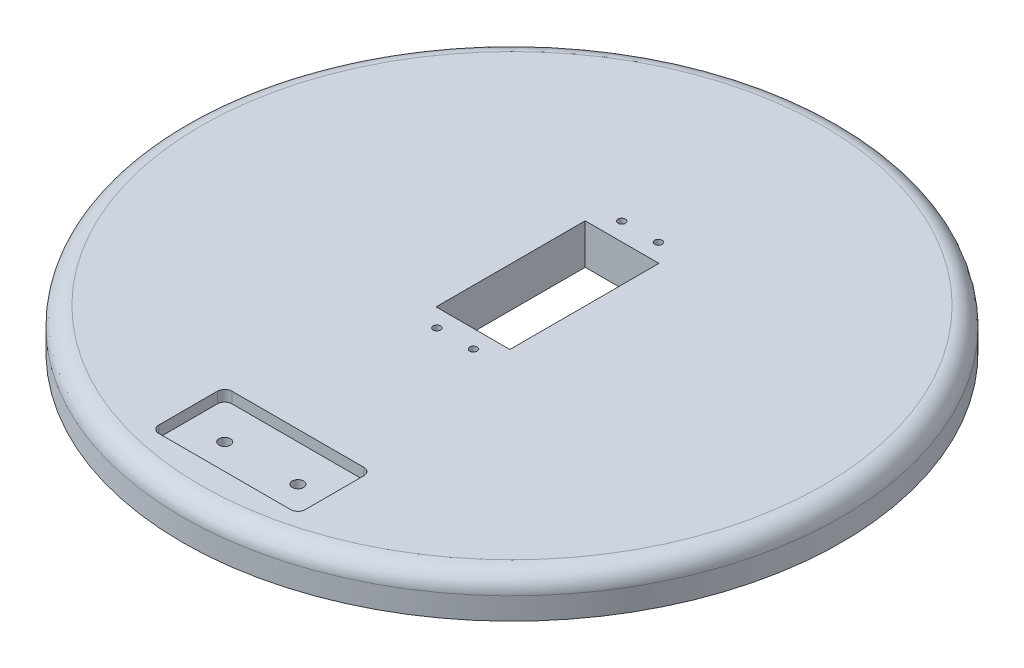
ISO-10303-21;
HEADER;
FILE_DESCRIPTION(('STEP AP214'),'2;1');
FILE_NAME('part.step','',(''),(''),'','','');
FILE_SCHEMA(('AUTOMOTIVE_DESIGN { 1 0 10303 214 1 1 1 1 }'));
ENDSEC;
DATA;
#1=APPLICATION_CONTEXT('core data for automotive mechanical design processes');
#2=APPLICATION_PROTOCOL_DEFINITION('international standard','automotive_design',2000,#1);
#3=PRODUCT_CONTEXT('',#1,'mechanical');
#4=PRODUCT('Part','Part','',(#3));
#5=PRODUCT_RELATED_PRODUCT_CATEGORY('part','',(#4));
#6=PRODUCT_DEFINITION_FORMATION('','',#4);
#7=PRODUCT_DEFINITION_CONTEXT('part definition',#1,'design');
#8=PRODUCT_DEFINITION('design','',#6,#7);
#9=PRODUCT_DEFINITION_SHAPE('','',#8);
#10=(LENGTH_UNIT() NAMED_UNIT(*) SI_UNIT(.MILLI.,.METRE.));
#11=(NAMED_UNIT(*) PLANE_ANGLE_UNIT() SI_UNIT($,.RADIAN.));
#12=(NAMED_UNIT(*) SI_UNIT($,.STERADIAN.) SOLID_ANGLE_UNIT());
#13=UNCERTAINTY_MEASURE_WITH_UNIT(LENGTH_MEASURE(1.E-05),#10,'distance_accuracy_value','');
#14=(GEOMETRIC_REPRESENTATION_CONTEXT(3) GLOBAL_UNCERTAINTY_ASSIGNED_CONTEXT((#13)) GLOBAL_UNIT_ASSIGNED_CONTEXT((#10,
#11,#12)) REPRESENTATION_CONTEXT('',''));
#15=CARTESIAN_POINT('',(0.,0.,0.));
#16=DIRECTION('',(0.,0.,1.));
#17=DIRECTION('',(1.,0.,0.));
#18=AXIS2_PLACEMENT_3D('',#15,#16,#17);
#19=CARTESIAN_POINT('',(0.,0.,0.));
#20=DIRECTION('',(0.,1.,0.));
#21=DIRECTION('',(0.,0.,1.));
#22=AXIS2_PLACEMENT_3D('',#19,#20,#21);
#23=PLANE('',#22);
#24=DIRECTION('',(1.,0.,0.));
#25=VECTOR('',#24,1.);
#26=CARTESIAN_POINT('',(0.,0.,10.6551884753543));
#27=LINE('',#26,#25);
#28=CARTESIAN_POINT('',(-10.0693248569401,0.,10.6551884753543));
#29=VERTEX_POINT('',#28);
#30=CARTESIAN_POINT('',(10.0705214341303,0.,10.6551884753543));
#31=VERTEX_POINT('',#30);
#32=EDGE_CURVE('E175',#29,#31,#27,.T.);
#33=ORIENTED_EDGE('',*,*,#32,.T.);
#34=DIRECTION('',(0.,0.,-1.));
#35=VECTOR('',#34,1.);
#36=CARTESIAN_POINT('',(10.0705214341303,0.,0.));
#37=LINE('',#36,#35);
#38=CARTESIAN_POINT('',(10.0705214341303,0.,-30.0651436325552));
#39=VERTEX_POINT('',#38);
#40=EDGE_CURVE('E179',#31,#39,#37,.T.);
#41=ORIENTED_EDGE('',*,*,#40,.T.);
#42=DIRECTION('',(-1.,0.,0.));
#43=VECTOR('',#42,1.);
#44=CARTESIAN_POINT('',(0.,0.,-30.0651436325552));
#45=LINE('',#44,#43);
#46=CARTESIAN_POINT('',(-10.0693248569401,0.,-30.0651436325552));
#47=VERTEX_POINT('',#46);
#48=EDGE_CURVE('E166',#39,#47,#45,.T.);
#49=ORIENTED_EDGE('',*,*,#48,.T.);
#50=DIRECTION('',(0.,0.,1.));
#51=VECTOR('',#50,1.);
#52=CARTESIAN_POINT('',(-10.0693248569401,0.,0.));
#53=LINE('',#52,#51);
#54=EDGE_CURVE('E141',#47,#29,#53,.T.);
#55=ORIENTED_EDGE('',*,*,#54,.T.);
#56=EDGE_LOOP('',(#33,#41,#49,#55));
#57=FACE_BOUND('',#56,.T.);
#58=CARTESIAN_POINT('',(-9.99999999999957,0.,68.4612874102777));
#59=DIRECTION('',(0.,-1.,0.));
#60=DIRECTION('',(0.,0.,-1.));
#61=AXIS2_PLACEMENT_3D('',#58,#59,#60);
#62=CIRCLE('',#61,3.);
#63=CARTESIAN_POINT('',(-9.99999999999957,0.,65.4612874102777));
#64=VERTEX_POINT('',#63);
#65=EDGE_CURVE('E209',#64,#64,#62,.T.);
#66=ORIENTED_EDGE('',*,*,#65,.F.);
#67=EDGE_LOOP('',(#66));
#68=FACE_BOUND('',#67,.T.);
#69=CARTESIAN_POINT('',(10.0000000000004,0.,68.4612874102777));
#70=DIRECTION('',(0.,-1.,0.));
#71=DIRECTION('',(0.,0.,-1.));
#72=AXIS2_PLACEMENT_3D('',#69,#70,#71);
#73=CIRCLE('',#72,3.);
#74=CARTESIAN_POINT('',(10.0000000000004,0.,65.4612874102777));
#75=VERTEX_POINT('',#74);
#76=EDGE_CURVE('E205',#75,#75,#73,.T.);
#77=ORIENTED_EDGE('',*,*,#76,.F.);
#78=EDGE_LOOP('',(#77));
#79=FACE_BOUND('',#78,.T.);
#80=CARTESIAN_POINT('',(7.22641595890606E-12,0.,1.67605903282807E-12));
#81=DIRECTION('',(0.,-1.,0.));
#82=DIRECTION('',(0.,0.,-1.));
#83=AXIS2_PLACEMENT_3D('',#80,#81,#82);
#84=CIRCLE('',#83,75.1999999999923);
#85=CARTESIAN_POINT('',(7.22641595890606E-12,0.,-75.1999999999906));
#86=VERTEX_POINT('',#85);
#87=EDGE_CURVE('E183',#86,#86,#84,.T.);
#88=ORIENTED_EDGE('',*,*,#87,.T.);
#89=EDGE_LOOP('',(#88));
#90=FACE_BOUND('',#89,.T.);
#91=ADVANCED_FACE('F45',(#57,#68,#79,#90),#23,.F.);
#92=CARTESIAN_POINT('',(-9.99999999999957,-12.,68.4612874102777));
#93=DIRECTION('',(0.,1.,0.));
#94=DIRECTION('',(0.,0.,1.));
#95=AXIS2_PLACEMENT_3D('',#92,#93,#94);
#96=CYLINDRICAL_SURFACE('',#95,1.55);
#97=CARTESIAN_POINT('',(-9.99999999999957,8.,68.4612874102777));
#98=DIRECTION('',(0.,1.,0.));
#99=DIRECTION('',(0.,0.,1.));
#100=AXIS2_PLACEMENT_3D('',#97,#98,#99);
#101=CIRCLE('',#100,1.55);
#102=CARTESIAN_POINT('',(-9.99999999999957,8.,70.0112874102777));
#103=VERTEX_POINT('',#102);
#104=EDGE_CURVE('E221',#103,#103,#101,.T.);
#105=ORIENTED_EDGE('',*,*,#104,.T.);
#106=EDGE_LOOP('',(#105));
#107=FACE_BOUND('',#106,.T.);
#108=CARTESIAN_POINT('',(-9.99999999999957,3.,68.4612874102777));
#109=DIRECTION('',(0.,-1.,0.));
#110=DIRECTION('',(0.,0.,-1.));
#111=AXIS2_PLACEMENT_3D('',#108,#109,#110);
#112=CIRCLE('',#111,1.55);
#113=CARTESIAN_POINT('',(-9.99999999999957,3.,66.9112874102777));
#114=VERTEX_POINT('',#113);
#115=EDGE_CURVE('E225',#114,#114,#112,.F.);
#116=ORIENTED_EDGE('',*,*,#115,.F.);
#117=EDGE_LOOP('',(#116));
#118=FACE_BOUND('',#117,.T.);
#119=ADVANCED_FACE('F339',(#107,#118),#96,.F.);
#120=CARTESIAN_POINT('',(10.0000000000004,-12.,68.4612874102777));
#121=DIRECTION('',(0.,1.,0.));
#122=DIRECTION('',(0.,0.,1.));
#123=AXIS2_PLACEMENT_3D('',#120,#121,#122);
#124=CYLINDRICAL_SURFACE('',#123,1.55);
#125=CARTESIAN_POINT('',(10.0000000000004,8.,68.4612874102777));
#126=DIRECTION('',(0.,1.,0.));
#127=DIRECTION('',(0.,0.,1.));
#128=AXIS2_PLACEMENT_3D('',#125,#126,#127);
#129=CIRCLE('',#128,1.55);
#130=CARTESIAN_POINT('',(10.0000000000004,8.,70.0112874102777));
#131=VERTEX_POINT('',#130);
#132=EDGE_CURVE('E216',#131,#131,#129,.T.);
#133=ORIENTED_EDGE('',*,*,#132,.T.);
#134=EDGE_LOOP('',(#133));
#135=FACE_BOUND('',#134,.T.);
#136=CARTESIAN_POINT('',(10.0000000000004,3.,68.4612874102777));
#137=DIRECTION('',(0.,-1.,0.));
#138=DIRECTION('',(0.,0.,-1.));
#139=AXIS2_PLACEMENT_3D('',#136,#137,#138);
#140=CIRCLE('',#139,1.55);
#141=CARTESIAN_POINT('',(10.0000000000004,3.,66.9112874102777));
#142=VERTEX_POINT('',#141);
#143=EDGE_CURVE('E204',#142,#142,#140,.F.);
#144=ORIENTED_EDGE('',*,*,#143,.F.);
#145=EDGE_LOOP('',(#144));
#146=FACE_BOUND('',#145,.T.);
#147=ADVANCED_FACE('F346',(#135,#146),#124,.F.);
#148=CARTESIAN_POINT('',(0.,11.,0.));
#149=DIRECTION('',(0.,-1.,0.));
#150=DIRECTION('',(0.,0.,-1.));
#151=AXIS2_PLACEMENT_3D('',#148,#149,#150);
#152=CYLINDRICAL_SURFACE('',#151,90.);
#153=CARTESIAN_POINT('',(0.,6.,0.));
#154=DIRECTION('',(0.,1.,0.));
#155=DIRECTION('',(0.,0.,1.));
#156=AXIS2_PLACEMENT_3D('',#153,#154,#155);
#157=CIRCLE('',#156,90.);
#158=CARTESIAN_POINT('',(0.,6.,90.));
#159=VERTEX_POINT('',#158);
#160=EDGE_CURVE('E11',#159,#159,#157,.F.);
#161=ORIENTED_EDGE('',*,*,#160,.T.);
#162=EDGE_LOOP('',(#161));
#163=FACE_BOUND('',#162,.T.);
#164=CARTESIAN_POINT('',(0.,0.,0.));
#165=DIRECTION('',(0.,1.,0.));
#166=DIRECTION('',(0.,0.,1.));
#167=AXIS2_PLACEMENT_3D('',#164,#165,#166);
#168=CIRCLE('',#167,90.);
#169=CARTESIAN_POINT('',(0.,0.,90.));
#170=VERTEX_POINT('',#169);
#171=EDGE_CURVE('E241',#170,#170,#168,.T.);
#172=ORIENTED_EDGE('',*,*,#171,.T.);
#173=EDGE_LOOP('',(#172));
#174=FACE_BOUND('',#173,.T.);
#175=ADVANCED_FACE('F364',(#163,#174),#152,.T.);
#176=CARTESIAN_POINT('',(0.,11.,0.));
#177=DIRECTION('',(0.,1.,0.));
#178=DIRECTION('',(0.,0.,1.));
#179=AXIS2_PLACEMENT_3D('',#176,#177,#178);
#180=PLANE('',#179);
#181=CARTESIAN_POINT('',(5.,11.,-34.9655002999993));
#182=DIRECTION('',(0.,1.,0.));
#183=DIRECTION('',(0.,0.,1.));
#184=AXIS2_PLACEMENT_3D('',#181,#182,#183);
#185=CIRCLE('',#184,1.);
#186=CARTESIAN_POINT('',(5.,11.,-33.9655002999993));
#187=VERTEX_POINT('',#186);
#188=EDGE_CURVE('E511',#187,#187,#185,.T.);
#189=ORIENTED_EDGE('',*,*,#188,.F.);
#190=EDGE_LOOP('',(#189));
#191=FACE_BOUND('',#190,.T.);
#192=CARTESIAN_POINT('',(-5.,11.,15.5345003000007));
#193=DIRECTION('',(0.,1.,0.));
#194=DIRECTION('',(0.,0.,1.));
#195=AXIS2_PLACEMENT_3D('',#192,#193,#194);
#196=CIRCLE('',#195,1.);
#197=CARTESIAN_POINT('',(-5.,11.,16.5345003000007));
#198=VERTEX_POINT('',#197);
#199=EDGE_CURVE('E507',#198,#198,#196,.T.);
#200=ORIENTED_EDGE('',*,*,#199,.F.);
#201=EDGE_LOOP('',(#200));
#202=FACE_BOUND('',#201,.T.);
#203=CARTESIAN_POINT('',(5.,11.,15.5345003000007));
#204=DIRECTION('',(0.,1.,0.));
#205=DIRECTION('',(0.,0.,1.));
#206=AXIS2_PLACEMENT_3D('',#203,#204,#205);
#207=CIRCLE('',#206,1.);
#208=CARTESIAN_POINT('',(5.,11.,16.5345003000007));
#209=VERTEX_POINT('',#208);
#210=EDGE_CURVE('E499',#209,#209,#207,.T.);
#211=ORIENTED_EDGE('',*,*,#210,.F.);
#212=EDGE_LOOP('',(#211));
#213=FACE_BOUND('',#212,.T.);
#214=CARTESIAN_POINT('',(-5.,11.,-34.9655002999993));
#215=DIRECTION('',(0.,1.,0.));
#216=DIRECTION('',(0.,0.,1.));
#217=AXIS2_PLACEMENT_3D('',#214,#215,#216);
#218=CIRCLE('',#217,1.);
#219=CARTESIAN_POINT('',(-5.,11.,-33.9655002999993));
#220=VERTEX_POINT('',#219);
#221=EDGE_CURVE('E515',#220,#220,#218,.T.);
#222=ORIENTED_EDGE('',*,*,#221,.F.);
#223=EDGE_LOOP('',(#222));
#224=FACE_BOUND('',#223,.T.);
#225=DIRECTION('',(0.,0.,-1.));
#226=VECTOR('',#225,1.);
#227=CARTESIAN_POINT('',(10.0705214341303,11.,10.6551884753543));
#228=LINE('',#227,#226);
#229=CARTESIAN_POINT('',(10.0705214341303,11.,10.6551884753543));
#230=VERTEX_POINT('',#229);
#231=CARTESIAN_POINT('',(10.0705214341303,11.,-30.0651436325552));
#232=VERTEX_POINT('',#231);
#233=EDGE_CURVE('E69',#230,#232,#228,.T.);
#234=ORIENTED_EDGE('',*,*,#233,.F.);
#235=DIRECTION('',(1.,0.,0.));
#236=VECTOR('',#235,1.);
#237=CARTESIAN_POINT('',(10.0705214341303,11.,10.6551884753543));
#238=LINE('',#237,#236);
#239=CARTESIAN_POINT('',(-10.0693248569401,11.,10.6551884753543));
#240=VERTEX_POINT('',#239);
#241=EDGE_CURVE('E156',#240,#230,#238,.T.);
#242=ORIENTED_EDGE('',*,*,#241,.F.);
#243=DIRECTION('',(0.,0.,1.));
#244=VECTOR('',#243,1.);
#245=CARTESIAN_POINT('',(-10.0693248569401,11.,10.6551884753543));
#246=LINE('',#245,#244);
#247=CARTESIAN_POINT('',(-10.0693248569401,11.,-30.0651436325552));
#248=VERTEX_POINT('',#247);
#249=EDGE_CURVE('E138',#248,#240,#246,.T.);
#250=ORIENTED_EDGE('',*,*,#249,.F.);
#251=DIRECTION('',(-1.,0.,0.));
#252=VECTOR('',#251,1.);
#253=CARTESIAN_POINT('',(10.0705214341303,11.,-30.0651436325552));
#254=LINE('',#253,#252);
#255=EDGE_CURVE('E148',#232,#248,#254,.T.);
#256=ORIENTED_EDGE('',*,*,#255,.F.);
#257=EDGE_LOOP('',(#234,#242,#250,#256));
#258=FACE_BOUND('',#257,.T.);
#259=CARTESIAN_POINT('',(0.,11.,0.));
#260=DIRECTION('',(0.,1.,0.));
#261=DIRECTION('',(0.,0.,1.));
#262=AXIS2_PLACEMENT_3D('',#259,#260,#261);
#263=CIRCLE('',#262,85.);
#264=CARTESIAN_POINT('',(0.,11.,85.));
#265=VERTEX_POINT('',#264);
#266=EDGE_CURVE('E54',#265,#265,#263,.T.);
#267=ORIENTED_EDGE('',*,*,#266,.T.);
#268=EDGE_LOOP('',(#267));
#269=FACE_BOUND('',#268,.T.);
#270=DIRECTION('',(0.,0.,1.));
#271=VECTOR('',#270,1.);
#272=CARTESIAN_POINT('',(-19.9999999999999,11.,58.4612874102777));
#273=LINE('',#272,#271);
#274=CARTESIAN_POINT('',(-19.9999999999999,11.,60.4612874102777));
#275=VERTEX_POINT('',#274);
#276=CARTESIAN_POINT('',(-19.9999999999999,11.,76.4612874102777));
#277=VERTEX_POINT('',#276);
#278=EDGE_CURVE('E220',#275,#277,#273,.T.);
#279=ORIENTED_EDGE('',*,*,#278,.F.);
#280=CARTESIAN_POINT('',(-17.9999999999999,11.,60.4612874102777));
#281=DIRECTION('',(0.,1.,0.));
#282=DIRECTION('',(0.,0.,1.));
#283=AXIS2_PLACEMENT_3D('',#280,#281,#282);
#284=CIRCLE('',#283,2.);
#285=CARTESIAN_POINT('',(-17.9999999999999,11.,58.4612874102777));
#286=VERTEX_POINT('',#285);
#287=EDGE_CURVE('E274',#275,#286,#284,.F.);
#288=ORIENTED_EDGE('',*,*,#287,.T.);
#289=DIRECTION('',(-1.,0.,0.));
#290=VECTOR('',#289,1.);
#291=CARTESIAN_POINT('',(-19.9999999999999,11.,58.4612874102777));
#292=LINE('',#291,#290);
#293=CARTESIAN_POINT('',(18.0000000000001,11.,58.4612874102777));
#294=VERTEX_POINT('',#293);
#295=EDGE_CURVE('E231',#294,#286,#292,.T.);
#296=ORIENTED_EDGE('',*,*,#295,.F.);
#297=CARTESIAN_POINT('',(18.0000000000001,11.,60.4612874102777));
#298=DIRECTION('',(0.,1.,0.));
#299=DIRECTION('',(0.,0.,1.));
#300=AXIS2_PLACEMENT_3D('',#297,#298,#299);
#301=CIRCLE('',#300,2.);
#302=CARTESIAN_POINT('',(20.0000000000001,11.,60.4612874102777));
#303=VERTEX_POINT('',#302);
#304=EDGE_CURVE('E289',#294,#303,#301,.F.);
#305=ORIENTED_EDGE('',*,*,#304,.T.);
#306=DIRECTION('',(0.,0.,-1.));
#307=VECTOR('',#306,1.);
#308=CARTESIAN_POINT('',(20.0000000000001,11.,58.4612874102777));
#309=LINE('',#308,#307);
#310=CARTESIAN_POINT('',(20.0000000000001,11.,76.4612874102777));
#311=VERTEX_POINT('',#310);
#312=EDGE_CURVE('E249',#311,#303,#309,.T.);
#313=ORIENTED_EDGE('',*,*,#312,.F.);
#314=CARTESIAN_POINT('',(18.0000000000001,11.,76.4612874102777));
#315=DIRECTION('',(0.,1.,0.));
#316=DIRECTION('',(0.,0.,1.));
#317=AXIS2_PLACEMENT_3D('',#314,#315,#316);
#318=CIRCLE('',#317,2.);
#319=CARTESIAN_POINT('',(18.0000000000001,11.,78.4612874102777));
#320=VERTEX_POINT('',#319);
#321=EDGE_CURVE('E316',#311,#320,#318,.F.);
#322=ORIENTED_EDGE('',*,*,#321,.T.);
#323=DIRECTION('',(1.,0.,0.));
#324=VECTOR('',#323,1.);
#325=CARTESIAN_POINT('',(-19.9999999999999,11.,78.4612874102777));
#326=LINE('',#325,#324);
#327=CARTESIAN_POINT('',(-17.9999999999999,11.,78.4612874102777));
#328=VERTEX_POINT('',#327);
#329=EDGE_CURVE('E245',#328,#320,#326,.T.);
#330=ORIENTED_EDGE('',*,*,#329,.F.);
#331=CARTESIAN_POINT('',(-17.9999999999999,11.,76.4612874102777));
#332=DIRECTION('',(0.,1.,0.));
#333=DIRECTION('',(0.,0.,1.));
#334=AXIS2_PLACEMENT_3D('',#331,#332,#333);
#335=CIRCLE('',#334,2.);
#336=EDGE_CURVE('E303',#328,#277,#335,.F.);
#337=ORIENTED_EDGE('',*,*,#336,.T.);
#338=EDGE_LOOP('',(#279,#288,#296,#305,#313,#322,#330,#337));
#339=FACE_BOUND('',#338,.T.);
#340=ADVANCED_FACE('F153',(#191,#202,#213,#224,#258,#269,#339),#180,.T.);
#341=CARTESIAN_POINT('',(7.22641595890606E-12,0.,1.67605903282807E-12));
#342=DIRECTION('',(0.,-1.,0.));
#343=DIRECTION('',(0.,0.,-1.));
#344=AXIS2_PLACEMENT_3D('',#341,#342,#343);
#345=CIRCLE('',#344,85.1999999999923);
#346=CARTESIAN_POINT('',(7.22641595890606E-12,0.,-85.1999999999906));
#347=VERTEX_POINT('',#346);
#348=EDGE_CURVE('E188',#347,#347,#345,.T.);
#349=ORIENTED_EDGE('',*,*,#348,.F.);
#350=EDGE_LOOP('',(#349));
#351=FACE_BOUND('',#350,.T.);
#352=ORIENTED_EDGE('',*,*,#171,.F.);
#353=EDGE_LOOP('',(#352));
#354=FACE_BOUND('',#353,.T.);
#355=ADVANCED_FACE('F342',(#351,#354),#23,.F.);
#356=CARTESIAN_POINT('',(-19.9999999999999,8.,58.4612874102777));
#357=DIRECTION('',(-1.,0.,0.));
#358=DIRECTION('',(0.,0.,1.));
#359=AXIS2_PLACEMENT_3D('',#356,#357,#358);
#360=PLANE('',#359);
#361=ORIENTED_EDGE('',*,*,#278,.T.);
#362=DIRECTION('',(0.,1.,0.));
#363=VECTOR('',#362,1.);
#364=CARTESIAN_POINT('',(-19.9999999999999,8.,76.4612874102777));
#365=LINE('',#364,#363);
#366=CARTESIAN_POINT('',(-19.9999999999999,8.,76.4612874102777));
#367=VERTEX_POINT('',#366);
#368=EDGE_CURVE('E297',#277,#367,#365,.F.);
#369=ORIENTED_EDGE('',*,*,#368,.T.);
#370=DIRECTION('',(0.,0.,1.));
#371=VECTOR('',#370,1.);
#372=CARTESIAN_POINT('',(-19.9999999999999,8.,58.4612874102777));
#373=LINE('',#372,#371);
#374=CARTESIAN_POINT('',(-19.9999999999999,8.,60.4612874102777));
#375=VERTEX_POINT('',#374);
#376=EDGE_CURVE('E226',#375,#367,#373,.T.);
#377=ORIENTED_EDGE('',*,*,#376,.F.);
#378=DIRECTION('',(0.,1.,0.));
#379=VECTOR('',#378,1.);
#380=CARTESIAN_POINT('',(-19.9999999999999,11.,60.4612874102777));
#381=LINE('',#380,#379);
#382=EDGE_CURVE('E257',#375,#275,#381,.T.);
#383=ORIENTED_EDGE('',*,*,#382,.T.);
#384=EDGE_LOOP('',(#361,#369,#377,#383));
#385=FACE_BOUND('',#384,.T.);
#386=ADVANCED_FACE('F353',(#385),#360,.F.);
#387=CARTESIAN_POINT('',(-19.9999999999999,8.,58.4612874102777));
#388=DIRECTION('',(0.,0.,-1.));
#389=DIRECTION('',(-1.,0.,0.));
#390=AXIS2_PLACEMENT_3D('',#387,#388,#389);
#391=PLANE('',#390);
#392=DIRECTION('',(-1.,0.,0.));
#393=VECTOR('',#392,1.);
#394=CARTESIAN_POINT('',(-19.9999999999999,8.,58.4612874102777));
#395=LINE('',#394,#393);
#396=CARTESIAN_POINT('',(18.0000000000001,8.,58.4612874102777));
#397=VERTEX_POINT('',#396);
#398=CARTESIAN_POINT('',(-17.9999999999999,8.,58.4612874102777));
#399=VERTEX_POINT('',#398);
#400=EDGE_CURVE('E238',#397,#399,#395,.T.);
#401=ORIENTED_EDGE('',*,*,#400,.F.);
#402=DIRECTION('',(0.,1.,0.));
#403=VECTOR('',#402,1.);
#404=CARTESIAN_POINT('',(18.0000000000001,11.,58.4612874102777));
#405=LINE('',#404,#403);
#406=EDGE_CURVE('E278',#397,#294,#405,.T.);
#407=ORIENTED_EDGE('',*,*,#406,.T.);
#408=ORIENTED_EDGE('',*,*,#295,.T.);
#409=DIRECTION('',(0.,1.,0.));
#410=VECTOR('',#409,1.);
#411=CARTESIAN_POINT('',(-17.9999999999999,8.,58.4612874102777));
#412=LINE('',#411,#410);
#413=EDGE_CURVE('E267',#286,#399,#412,.F.);
#414=ORIENTED_EDGE('',*,*,#413,.T.);
#415=EDGE_LOOP('',(#401,#407,#408,#414));
#416=FACE_BOUND('',#415,.T.);
#417=ADVANCED_FACE('F360',(#416),#391,.F.);
#418=CARTESIAN_POINT('',(20.0000000000001,8.,58.4612874102777));
#419=DIRECTION('',(1.,0.,0.));
#420=DIRECTION('',(0.,0.,-1.));
#421=AXIS2_PLACEMENT_3D('',#418,#419,#420);
#422=PLANE('',#421);
#423=DIRECTION('',(0.,0.,-1.));
#424=VECTOR('',#423,1.);
#425=CARTESIAN_POINT('',(20.0000000000001,8.,58.4612874102777));
#426=LINE('',#425,#424);
#427=CARTESIAN_POINT('',(20.0000000000001,8.,76.4612874102777));
#428=VERTEX_POINT('',#427);
#429=CARTESIAN_POINT('',(20.0000000000001,8.,60.4612874102777));
#430=VERTEX_POINT('',#429);
#431=EDGE_CURVE('E235',#428,#430,#426,.T.);
#432=ORIENTED_EDGE('',*,*,#431,.F.);
#433=DIRECTION('',(0.,1.,0.));
#434=VECTOR('',#433,1.);
#435=CARTESIAN_POINT('',(20.0000000000001,11.,76.4612874102777));
#436=LINE('',#435,#434);
#437=EDGE_CURVE('E306',#428,#311,#436,.T.);
#438=ORIENTED_EDGE('',*,*,#437,.T.);
#439=ORIENTED_EDGE('',*,*,#312,.T.);
#440=DIRECTION('',(0.,1.,0.));
#441=VECTOR('',#440,1.);
#442=CARTESIAN_POINT('',(20.0000000000001,8.,60.4612874102777));
#443=LINE('',#442,#441);
#444=EDGE_CURVE('E282',#303,#430,#443,.F.);
#445=ORIENTED_EDGE('',*,*,#444,.T.);
#446=EDGE_LOOP('',(#432,#438,#439,#445));
#447=FACE_BOUND('',#446,.T.);
#448=ADVANCED_FACE('F405',(#447),#422,.F.);
#449=CARTESIAN_POINT('',(-19.9999999999999,8.,78.4612874102777));
#450=DIRECTION('',(0.,0.,1.));
#451=DIRECTION('',(1.,0.,0.));
#452=AXIS2_PLACEMENT_3D('',#449,#450,#451);
#453=PLANE('',#452);
#454=ORIENTED_EDGE('',*,*,#329,.T.);
#455=DIRECTION('',(0.,1.,0.));
#456=VECTOR('',#455,1.);
#457=CARTESIAN_POINT('',(18.0000000000001,8.,78.4612874102777));
#458=LINE('',#457,#456);
#459=CARTESIAN_POINT('',(18.0000000000001,8.,78.4612874102777));
#460=VERTEX_POINT('',#459);
#461=EDGE_CURVE('E310',#320,#460,#458,.F.);
#462=ORIENTED_EDGE('',*,*,#461,.T.);
#463=DIRECTION('',(1.,0.,0.));
#464=VECTOR('',#463,1.);
#465=CARTESIAN_POINT('',(-19.9999999999999,8.,78.4612874102777));
#466=LINE('',#465,#464);
#467=CARTESIAN_POINT('',(-17.9999999999999,8.,78.4612874102777));
#468=VERTEX_POINT('',#467);
#469=EDGE_CURVE('E230',#468,#460,#466,.T.);
#470=ORIENTED_EDGE('',*,*,#469,.F.);
#471=DIRECTION('',(0.,1.,0.));
#472=VECTOR('',#471,1.);
#473=CARTESIAN_POINT('',(-17.9999999999999,11.,78.4612874102777));
#474=LINE('',#473,#472);
#475=EDGE_CURVE('E293',#468,#328,#474,.T.);
#476=ORIENTED_EDGE('',*,*,#475,.T.);
#477=EDGE_LOOP('',(#454,#462,#470,#476));
#478=FACE_BOUND('',#477,.T.);
#479=ADVANCED_FACE('F422',(#478),#453,.F.);
#480=CARTESIAN_POINT('',(0.,8.,0.));
#481=DIRECTION('',(0.,1.,0.));
#482=DIRECTION('',(0.,0.,1.));
#483=AXIS2_PLACEMENT_3D('',#480,#481,#482);
#484=PLANE('',#483);
#485=ORIENTED_EDGE('',*,*,#132,.F.);
#486=EDGE_LOOP('',(#485));
#487=FACE_BOUND('',#486,.T.);
#488=ORIENTED_EDGE('',*,*,#104,.F.);
#489=EDGE_LOOP('',(#488));
#490=FACE_BOUND('',#489,.T.);
#491=ORIENTED_EDGE('',*,*,#469,.T.);
#492=CARTESIAN_POINT('',(18.0000000000001,8.,76.4612874102777));
#493=DIRECTION('',(0.,1.,0.));
#494=DIRECTION('',(0.,0.,1.));
#495=AXIS2_PLACEMENT_3D('',#492,#493,#494);
#496=CIRCLE('',#495,2.);
#497=EDGE_CURVE('E313',#460,#428,#496,.T.);
#498=ORIENTED_EDGE('',*,*,#497,.T.);
#499=ORIENTED_EDGE('',*,*,#431,.T.);
#500=CARTESIAN_POINT('',(18.0000000000001,8.,60.4612874102777));
#501=DIRECTION('',(0.,1.,0.));
#502=DIRECTION('',(0.,0.,1.));
#503=AXIS2_PLACEMENT_3D('',#500,#501,#502);
#504=CIRCLE('',#503,2.);
#505=EDGE_CURVE('E286',#430,#397,#504,.T.);
#506=ORIENTED_EDGE('',*,*,#505,.T.);
#507=ORIENTED_EDGE('',*,*,#400,.T.);
#508=CARTESIAN_POINT('',(-17.9999999999999,8.,60.4612874102777));
#509=DIRECTION('',(0.,1.,0.));
#510=DIRECTION('',(0.,0.,1.));
#511=AXIS2_PLACEMENT_3D('',#508,#509,#510);
#512=CIRCLE('',#511,2.);
#513=EDGE_CURVE('E271',#399,#375,#512,.T.);
#514=ORIENTED_EDGE('',*,*,#513,.T.);
#515=ORIENTED_EDGE('',*,*,#376,.T.);
#516=CARTESIAN_POINT('',(-17.9999999999999,8.,76.4612874102777));
#517=DIRECTION('',(0.,1.,0.));
#518=DIRECTION('',(0.,0.,1.));
#519=AXIS2_PLACEMENT_3D('',#516,#517,#518);
#520=CIRCLE('',#519,2.);
#521=EDGE_CURVE('E300',#367,#468,#520,.T.);
#522=ORIENTED_EDGE('',*,*,#521,.T.);
#523=EDGE_LOOP('',(#491,#498,#499,#506,#507,#514,#515,#522));
#524=FACE_BOUND('',#523,.T.);
#525=ADVANCED_FACE('F402',(#487,#490,#524),#484,.T.);
#526=CARTESIAN_POINT('',(10.0000000000004,3.,68.4612874102777));
#527=DIRECTION('',(0.,-1.,0.));
#528=DIRECTION('',(0.,0.,-1.));
#529=AXIS2_PLACEMENT_3D('',#526,#527,#528);
#530=PLANE('',#529);
#531=CARTESIAN_POINT('',(10.0000000000004,3.,68.4612874102777));
#532=DIRECTION('',(0.,-1.,0.));
#533=DIRECTION('',(0.,0.,-1.));
#534=AXIS2_PLACEMENT_3D('',#531,#532,#533);
#535=CIRCLE('',#534,3.);
#536=CARTESIAN_POINT('',(10.0000000000004,3.,65.4612874102777));
#537=VERTEX_POINT('',#536);
#538=EDGE_CURVE('E200',#537,#537,#535,.T.);
#539=ORIENTED_EDGE('',*,*,#538,.T.);
#540=EDGE_LOOP('',(#539));
#541=FACE_BOUND('',#540,.T.);
#542=ORIENTED_EDGE('',*,*,#143,.T.);
#543=EDGE_LOOP('',(#542));
#544=FACE_BOUND('',#543,.T.);
#545=ADVANCED_FACE('F429',(#541,#544),#530,.T.);
#546=CARTESIAN_POINT('',(10.0000000000004,3.,68.4612874102777));
#547=DIRECTION('',(0.,-1.,0.));
#548=DIRECTION('',(0.,0.,-1.));
#549=AXIS2_PLACEMENT_3D('',#546,#547,#548);
#550=CYLINDRICAL_SURFACE('',#549,3.);
#551=ORIENTED_EDGE('',*,*,#538,.F.);
#552=EDGE_LOOP('',(#551));
#553=FACE_BOUND('',#552,.T.);
#554=ORIENTED_EDGE('',*,*,#76,.T.);
#555=EDGE_LOOP('',(#554));
#556=FACE_BOUND('',#555,.T.);
#557=ADVANCED_FACE('F439',(#553,#556),#550,.F.);
#558=CARTESIAN_POINT('',(-9.99999999999957,3.,68.4612874102777));
#559=DIRECTION('',(0.,-1.,0.));
#560=DIRECTION('',(0.,0.,-1.));
#561=AXIS2_PLACEMENT_3D('',#558,#559,#560);
#562=PLANE('',#561);
#563=CARTESIAN_POINT('',(-9.99999999999957,3.,68.4612874102777));
#564=DIRECTION('',(0.,-1.,0.));
#565=DIRECTION('',(0.,0.,-1.));
#566=AXIS2_PLACEMENT_3D('',#563,#564,#565);
#567=CIRCLE('',#566,3.);
#568=CARTESIAN_POINT('',(-9.99999999999957,3.,65.4612874102777));
#569=VERTEX_POINT('',#568);
#570=EDGE_CURVE('E196',#569,#569,#567,.T.);
#571=ORIENTED_EDGE('',*,*,#570,.T.);
#572=EDGE_LOOP('',(#571));
#573=FACE_BOUND('',#572,.T.);
#574=ORIENTED_EDGE('',*,*,#115,.T.);
#575=EDGE_LOOP('',(#574));
#576=FACE_BOUND('',#575,.T.);
#577=ADVANCED_FACE('F436',(#573,#576),#562,.T.);
#578=CARTESIAN_POINT('',(-9.99999999999957,3.,68.4612874102777));
#579=DIRECTION('',(0.,-1.,0.));
#580=DIRECTION('',(0.,0.,-1.));
#581=AXIS2_PLACEMENT_3D('',#578,#579,#580);
#582=CYLINDRICAL_SURFACE('',#581,3.);
#583=ORIENTED_EDGE('',*,*,#570,.F.);
#584=EDGE_LOOP('',(#583));
#585=FACE_BOUND('',#584,.T.);
#586=ORIENTED_EDGE('',*,*,#65,.T.);
#587=EDGE_LOOP('',(#586));
#588=FACE_BOUND('',#587,.T.);
#589=ADVANCED_FACE('F381',(#585,#588),#582,.F.);
#590=CARTESIAN_POINT('',(-17.9999999999999,8.,60.4612874102777));
#591=DIRECTION('',(0.,-1.,0.));
#592=DIRECTION('',(0.,0.,-1.));
#593=AXIS2_PLACEMENT_3D('',#590,#591,#592);
#594=CYLINDRICAL_SURFACE('',#593,2.);
#595=ORIENTED_EDGE('',*,*,#513,.F.);
#596=ORIENTED_EDGE('',*,*,#413,.F.);
#597=ORIENTED_EDGE('',*,*,#287,.F.);
#598=ORIENTED_EDGE('',*,*,#382,.F.);
#599=EDGE_LOOP('',(#595,#596,#597,#598));
#600=FACE_BOUND('',#599,.T.);
#601=ADVANCED_FACE('F377',(#600),#594,.F.);
#602=CARTESIAN_POINT('',(18.0000000000001,8.,60.4612874102777));
#603=DIRECTION('',(0.,-1.,0.));
#604=DIRECTION('',(0.,0.,-1.));
#605=AXIS2_PLACEMENT_3D('',#602,#603,#604);
#606=CYLINDRICAL_SURFACE('',#605,2.);
#607=ORIENTED_EDGE('',*,*,#505,.F.);
#608=ORIENTED_EDGE('',*,*,#444,.F.);
#609=ORIENTED_EDGE('',*,*,#304,.F.);
#610=ORIENTED_EDGE('',*,*,#406,.F.);
#611=EDGE_LOOP('',(#607,#608,#609,#610));
#612=FACE_BOUND('',#611,.T.);
#613=ADVANCED_FACE('F380',(#612),#606,.F.);
#614=CARTESIAN_POINT('',(-17.9999999999999,8.,76.4612874102777));
#615=DIRECTION('',(0.,-1.,0.));
#616=DIRECTION('',(0.,0.,-1.));
#617=AXIS2_PLACEMENT_3D('',#614,#615,#616);
#618=CYLINDRICAL_SURFACE('',#617,2.);
#619=ORIENTED_EDGE('',*,*,#521,.F.);
#620=ORIENTED_EDGE('',*,*,#368,.F.);
#621=ORIENTED_EDGE('',*,*,#336,.F.);
#622=ORIENTED_EDGE('',*,*,#475,.F.);
#623=EDGE_LOOP('',(#619,#620,#621,#622));
#624=FACE_BOUND('',#623,.T.);
#625=ADVANCED_FACE('F385',(#624),#618,.F.);
#626=CARTESIAN_POINT('',(18.0000000000001,8.,76.4612874102777));
#627=DIRECTION('',(0.,-1.,0.));
#628=DIRECTION('',(0.,0.,-1.));
#629=AXIS2_PLACEMENT_3D('',#626,#627,#628);
#630=CYLINDRICAL_SURFACE('',#629,2.);
#631=ORIENTED_EDGE('',*,*,#497,.F.);
#632=ORIENTED_EDGE('',*,*,#461,.F.);
#633=ORIENTED_EDGE('',*,*,#321,.F.);
#634=ORIENTED_EDGE('',*,*,#437,.F.);
#635=EDGE_LOOP('',(#631,#632,#633,#634));
#636=FACE_BOUND('',#635,.T.);
#637=ADVANCED_FACE('F388',(#636),#630,.F.);
#638=CARTESIAN_POINT('',(7.22641595890606E-12,6.,1.67605903282807E-12));
#639=DIRECTION('',(0.,-1.,0.));
#640=DIRECTION('',(0.,0.,-1.));
#641=AXIS2_PLACEMENT_3D('',#638,#639,#640);
#642=CYLINDRICAL_SURFACE('',#641,85.1999999999923);
#643=CARTESIAN_POINT('',(7.22641595890606E-12,6.,1.67605903282807E-12));
#644=DIRECTION('',(0.,-1.,0.));
#645=DIRECTION('',(0.,0.,-1.));
#646=AXIS2_PLACEMENT_3D('',#643,#644,#645);
#647=CIRCLE('',#646,85.1999999999923);
#648=CARTESIAN_POINT('',(7.22641595890606E-12,6.,-85.1999999999906));
#649=VERTEX_POINT('',#648);
#650=EDGE_CURVE('E192',#649,#649,#647,.T.);
#651=ORIENTED_EDGE('',*,*,#650,.F.);
#652=EDGE_LOOP('',(#651));
#653=FACE_BOUND('',#652,.T.);
#654=ORIENTED_EDGE('',*,*,#348,.T.);
#655=EDGE_LOOP('',(#654));
#656=FACE_BOUND('',#655,.T.);
#657=ADVANCED_FACE('F390',(#653,#656),#642,.F.);
#658=CARTESIAN_POINT('',(7.22641595890606E-12,6.,1.67605903282807E-12));
#659=DIRECTION('',(0.,-1.,0.));
#660=DIRECTION('',(0.,0.,-1.));
#661=AXIS2_PLACEMENT_3D('',#658,#659,#660);
#662=PLANE('',#661);
#663=CARTESIAN_POINT('',(7.22641595890606E-12,6.,1.67605903282807E-12));
#664=DIRECTION('',(0.,-1.,0.));
#665=DIRECTION('',(0.,0.,-1.));
#666=AXIS2_PLACEMENT_3D('',#663,#664,#665);
#667=CIRCLE('',#666,75.1999999999923);
#668=CARTESIAN_POINT('',(7.22641595890606E-12,6.,-75.1999999999906));
#669=VERTEX_POINT('',#668);
#670=EDGE_CURVE('E184',#669,#669,#667,.T.);
#671=ORIENTED_EDGE('',*,*,#670,.F.);
#672=EDGE_LOOP('',(#671));
#673=FACE_BOUND('',#672,.T.);
#674=ORIENTED_EDGE('',*,*,#650,.T.);
#675=EDGE_LOOP('',(#674));
#676=FACE_BOUND('',#675,.T.);
#677=ADVANCED_FACE('F335',(#673,#676),#662,.T.);
#678=CARTESIAN_POINT('',(7.22641595890606E-12,6.,1.67605903282807E-12));
#679=DIRECTION('',(0.,-1.,0.));
#680=DIRECTION('',(0.,0.,-1.));
#681=AXIS2_PLACEMENT_3D('',#678,#679,#680);
#682=CYLINDRICAL_SURFACE('',#681,75.1999999999923);
#683=ORIENTED_EDGE('',*,*,#670,.T.);
#684=EDGE_LOOP('',(#683));
#685=FACE_BOUND('',#684,.T.);
#686=ORIENTED_EDGE('',*,*,#87,.F.);
#687=EDGE_LOOP('',(#686));
#688=FACE_BOUND('',#687,.T.);
#689=ADVANCED_FACE('F325',(#685,#688),#682,.T.);
#690=CARTESIAN_POINT('',(0.,6.,0.));
#691=DIRECTION('',(0.,1.,0.));
#692=DIRECTION('',(0.,0.,1.));
#693=AXIS2_PLACEMENT_3D('',#690,#691,#692);
#694=TOROIDAL_SURFACE('',#693,85.,5.);
#695=ORIENTED_EDGE('',*,*,#160,.F.);
#696=EDGE_LOOP('',(#695));
#697=FACE_BOUND('',#696,.T.);
#698=ORIENTED_EDGE('',*,*,#266,.F.);
#699=EDGE_LOOP('',(#698));
#700=FACE_BOUND('',#699,.T.);
#701=ADVANCED_FACE('F47',(#697,#700),#694,.T.);
#702=CARTESIAN_POINT('',(10.0705214341303,-9.,10.6551884753543));
#703=DIRECTION('',(1.,0.,0.));
#704=DIRECTION('',(0.,0.,-1.));
#705=AXIS2_PLACEMENT_3D('',#702,#703,#704);
#706=PLANE('',#705);
#707=DIRECTION('',(0.,1.,0.));
#708=VECTOR('',#707,1.);
#709=CARTESIAN_POINT('',(10.0705214341303,-9.,10.6551884753543));
#710=LINE('',#709,#708);
#711=EDGE_CURVE('E163',#31,#230,#710,.T.);
#712=ORIENTED_EDGE('',*,*,#711,.T.);
#713=ORIENTED_EDGE('',*,*,#233,.T.);
#714=DIRECTION('',(0.,1.,0.));
#715=VECTOR('',#714,1.);
#716=CARTESIAN_POINT('',(10.0705214341303,-9.,-30.0651436325552));
#717=LINE('',#716,#715);
#718=EDGE_CURVE('E145',#39,#232,#717,.T.);
#719=ORIENTED_EDGE('',*,*,#718,.F.);
#720=ORIENTED_EDGE('',*,*,#40,.F.);
#721=EDGE_LOOP('',(#712,#713,#719,#720));
#722=FACE_BOUND('',#721,.T.);
#723=ADVANCED_FACE('F324',(#722),#706,.F.);
#724=CARTESIAN_POINT('',(10.0705214341303,-9.,10.6551884753543));
#725=DIRECTION('',(0.,0.,1.));
#726=DIRECTION('',(1.,0.,0.));
#727=AXIS2_PLACEMENT_3D('',#724,#725,#726);
#728=PLANE('',#727);
#729=DIRECTION('',(0.,1.,0.));
#730=VECTOR('',#729,1.);
#731=CARTESIAN_POINT('',(-10.0693248569401,-9.,10.6551884753543));
#732=LINE('',#731,#730);
#733=EDGE_CURVE('E144',#29,#240,#732,.T.);
#734=ORIENTED_EDGE('',*,*,#733,.T.);
#735=ORIENTED_EDGE('',*,*,#241,.T.);
#736=ORIENTED_EDGE('',*,*,#711,.F.);
#737=ORIENTED_EDGE('',*,*,#32,.F.);
#738=EDGE_LOOP('',(#734,#735,#736,#737));
#739=FACE_BOUND('',#738,.T.);
#740=ADVANCED_FACE('F332',(#739),#728,.F.);
#741=CARTESIAN_POINT('',(-10.0693248569401,-9.,10.6551884753543));
#742=DIRECTION('',(-1.,0.,0.));
#743=DIRECTION('',(0.,0.,1.));
#744=AXIS2_PLACEMENT_3D('',#741,#742,#743);
#745=PLANE('',#744);
#746=DIRECTION('',(0.,1.,0.));
#747=VECTOR('',#746,1.);
#748=CARTESIAN_POINT('',(-10.0693248569401,-9.,-30.0651436325552));
#749=LINE('',#748,#747);
#750=EDGE_CURVE('E61',#47,#248,#749,.T.);
#751=ORIENTED_EDGE('',*,*,#750,.T.);
#752=ORIENTED_EDGE('',*,*,#249,.T.);
#753=ORIENTED_EDGE('',*,*,#733,.F.);
#754=ORIENTED_EDGE('',*,*,#54,.F.);
#755=EDGE_LOOP('',(#751,#752,#753,#754));
#756=FACE_BOUND('',#755,.T.);
#757=ADVANCED_FACE('F135',(#756),#745,.F.);
#758=CARTESIAN_POINT('',(10.0705214341303,-9.,-30.0651436325552));
#759=DIRECTION('',(0.,0.,-1.));
#760=DIRECTION('',(-1.,0.,0.));
#761=AXIS2_PLACEMENT_3D('',#758,#759,#760);
#762=PLANE('',#761);
#763=ORIENTED_EDGE('',*,*,#718,.T.);
#764=ORIENTED_EDGE('',*,*,#255,.T.);
#765=ORIENTED_EDGE('',*,*,#750,.F.);
#766=ORIENTED_EDGE('',*,*,#48,.F.);
#767=EDGE_LOOP('',(#763,#764,#765,#766));
#768=FACE_BOUND('',#767,.T.);
#769=ADVANCED_FACE('F149',(#768),#762,.F.);
#770=CARTESIAN_POINT('',(-5.,0.999999999999999,-34.9655002999993));
#771=DIRECTION('',(0.,1.,0.));
#772=DIRECTION('',(0.,0.,1.));
#773=AXIS2_PLACEMENT_3D('',#770,#771,#772);
#774=CYLINDRICAL_SURFACE('',#773,1.);
#775=CARTESIAN_POINT('',(-5.,0.999999999999999,-34.9655002999993));
#776=DIRECTION('',(0.,1.,0.));
#777=DIRECTION('',(0.,0.,1.));
#778=AXIS2_PLACEMENT_3D('',#775,#776,#777);
#779=CIRCLE('',#778,1.);
#780=CARTESIAN_POINT('',(-5.,0.999999999999999,-33.9655002999993));
#781=VERTEX_POINT('',#780);
#782=EDGE_CURVE('E523',#781,#781,#779,.T.);
#783=ORIENTED_EDGE('',*,*,#782,.F.);
#784=EDGE_LOOP('',(#783));
#785=FACE_BOUND('',#784,.T.);
#786=ORIENTED_EDGE('',*,*,#221,.T.);
#787=EDGE_LOOP('',(#786));
#788=FACE_BOUND('',#787,.T.);
#789=ADVANCED_FACE('F455',(#785,#788),#774,.F.);
#790=CARTESIAN_POINT('',(-5.,0.999999999999999,-34.9655002999993));
#791=DIRECTION('',(0.,1.,0.));
#792=DIRECTION('',(0.,0.,1.));
#793=AXIS2_PLACEMENT_3D('',#790,#791,#792);
#794=PLANE('',#793);
#795=ORIENTED_EDGE('',*,*,#782,.T.);
#796=EDGE_LOOP('',(#795));
#797=FACE_BOUND('',#796,.T.);
#798=ADVANCED_FACE('F463',(#797),#794,.T.);
#799=CARTESIAN_POINT('',(5.,0.999999999999999,15.5345003000007));
#800=DIRECTION('',(0.,1.,0.));
#801=DIRECTION('',(0.,0.,1.));
#802=AXIS2_PLACEMENT_3D('',#799,#800,#801);
#803=CYLINDRICAL_SURFACE('',#802,1.);
#804=CARTESIAN_POINT('',(5.,0.999999999999999,15.5345003000007));
#805=DIRECTION('',(0.,1.,0.));
#806=DIRECTION('',(0.,0.,1.));
#807=AXIS2_PLACEMENT_3D('',#804,#805,#806);
#808=CIRCLE('',#807,1.);
#809=CARTESIAN_POINT('',(5.,0.999999999999999,16.5345003000007));
#810=VERTEX_POINT('',#809);
#811=EDGE_CURVE('E496',#810,#810,#808,.T.);
#812=ORIENTED_EDGE('',*,*,#811,.F.);
#813=EDGE_LOOP('',(#812));
#814=FACE_BOUND('',#813,.T.);
#815=ORIENTED_EDGE('',*,*,#210,.T.);
#816=EDGE_LOOP('',(#815));
#817=FACE_BOUND('',#816,.T.);
#818=ADVANCED_FACE('F467',(#814,#817),#803,.F.);
#819=CARTESIAN_POINT('',(5.,0.999999999999999,15.5345003000007));
#820=DIRECTION('',(0.,1.,0.));
#821=DIRECTION('',(0.,0.,1.));
#822=AXIS2_PLACEMENT_3D('',#819,#820,#821);
#823=PLANE('',#822);
#824=ORIENTED_EDGE('',*,*,#811,.T.);
#825=EDGE_LOOP('',(#824));
#826=FACE_BOUND('',#825,.T.);
#827=ADVANCED_FACE('F477',(#826),#823,.T.);
#828=CARTESIAN_POINT('',(-5.,0.999999999999999,15.5345003000007));
#829=DIRECTION('',(0.,1.,0.));
#830=DIRECTION('',(0.,0.,1.));
#831=AXIS2_PLACEMENT_3D('',#828,#829,#830);
#832=CYLINDRICAL_SURFACE('',#831,1.);
#833=CARTESIAN_POINT('',(-5.,0.999999999999999,15.5345003000007));
#834=DIRECTION('',(0.,1.,0.));
#835=DIRECTION('',(0.,0.,1.));
#836=AXIS2_PLACEMENT_3D('',#833,#834,#835);
#837=CIRCLE('',#836,1.);
#838=CARTESIAN_POINT('',(-5.,0.999999999999999,16.5345003000007));
#839=VERTEX_POINT('',#838);
#840=EDGE_CURVE('E502',#839,#839,#837,.T.);
#841=ORIENTED_EDGE('',*,*,#840,.F.);
#842=EDGE_LOOP('',(#841));
#843=FACE_BOUND('',#842,.T.);
#844=ORIENTED_EDGE('',*,*,#199,.T.);
#845=EDGE_LOOP('',(#844));
#846=FACE_BOUND('',#845,.T.);
#847=ADVANCED_FACE('F473',(#843,#846),#832,.F.);
#848=CARTESIAN_POINT('',(-5.,0.999999999999999,15.5345003000007));
#849=DIRECTION('',(0.,1.,0.));
#850=DIRECTION('',(0.,0.,1.));
#851=AXIS2_PLACEMENT_3D('',#848,#849,#850);
#852=PLANE('',#851);
#853=ORIENTED_EDGE('',*,*,#840,.T.);
#854=EDGE_LOOP('',(#853));
#855=FACE_BOUND('',#854,.T.);
#856=ADVANCED_FACE('F469',(#855),#852,.T.);
#857=CARTESIAN_POINT('',(5.,0.999999999999999,-34.9655002999993));
#858=DIRECTION('',(0.,1.,0.));
#859=DIRECTION('',(0.,0.,1.));
#860=AXIS2_PLACEMENT_3D('',#857,#858,#859);
#861=CYLINDRICAL_SURFACE('',#860,1.);
#862=CARTESIAN_POINT('',(5.,0.999999999999999,-34.9655002999993));
#863=DIRECTION('',(0.,1.,0.));
#864=DIRECTION('',(0.,0.,1.));
#865=AXIS2_PLACEMENT_3D('',#862,#863,#864);
#866=CIRCLE('',#865,1.);
#867=CARTESIAN_POINT('',(5.,0.999999999999999,-33.9655002999993));
#868=VERTEX_POINT('',#867);
#869=EDGE_CURVE('E516',#868,#868,#866,.T.);
#870=ORIENTED_EDGE('',*,*,#869,.F.);
#871=EDGE_LOOP('',(#870));
#872=FACE_BOUND('',#871,.T.);
#873=ORIENTED_EDGE('',*,*,#188,.T.);
#874=EDGE_LOOP('',(#873));
#875=FACE_BOUND('',#874,.T.);
#876=ADVANCED_FACE('F472',(#872,#875),#861,.F.);
#877=CARTESIAN_POINT('',(5.,0.999999999999999,-34.9655002999993));
#878=DIRECTION('',(0.,1.,0.));
#879=DIRECTION('',(0.,0.,1.));
#880=AXIS2_PLACEMENT_3D('',#877,#878,#879);
#881=PLANE('',#880);
#882=ORIENTED_EDGE('',*,*,#869,.T.);
#883=EDGE_LOOP('',(#882));
#884=FACE_BOUND('',#883,.T.);
#885=ADVANCED_FACE('F479',(#884),#881,.T.);
#886=CLOSED_SHELL('',(#91,#119,#147,#175,#340,#355,#386,#417,#448,#479,#525,#545,#557,#577,#589,
#601,#613,#625,#637,#657,#677,#689,#701,#723,#740,#757,#769,#789,#798,#818,#827,#847,#856,#876,#885));
#887=MANIFOLD_SOLID_BREP('B2',#886);
#888=ADVANCED_BREP_SHAPE_REPRESENTATION('',(#18,#887),#14);
#889=SHAPE_DEFINITION_REPRESENTATION(#9,#888);
ENDSEC;
END-ISO-10303-21;
